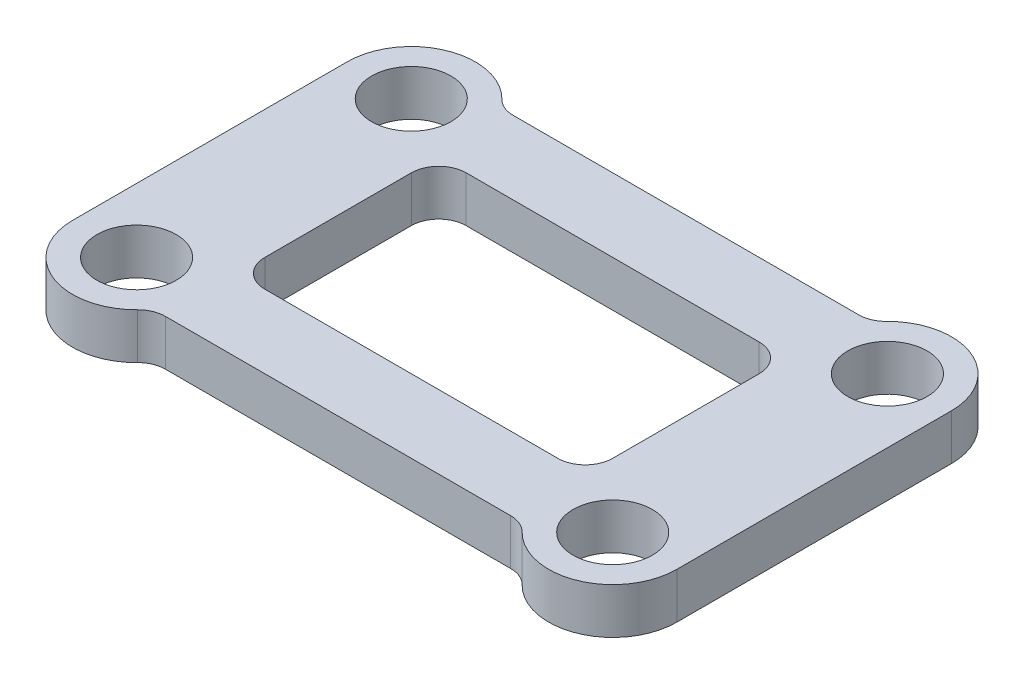
ISO-10303-21;
HEADER;
FILE_DESCRIPTION(('STEP AP214'),'2;1');
FILE_NAME('part.step','',(''),(''),'','','');
FILE_SCHEMA(('AUTOMOTIVE_DESIGN { 1 0 10303 214 1 1 1 1 }'));
ENDSEC;
DATA;
#1=APPLICATION_CONTEXT('core data for automotive mechanical design processes');
#2=APPLICATION_PROTOCOL_DEFINITION('international standard','automotive_design',2000,#1);
#3=PRODUCT_CONTEXT('',#1,'mechanical');
#4=PRODUCT('Part','Part','',(#3));
#5=PRODUCT_RELATED_PRODUCT_CATEGORY('part','',(#4));
#6=PRODUCT_DEFINITION_FORMATION('','',#4);
#7=PRODUCT_DEFINITION_CONTEXT('part definition',#1,'design');
#8=PRODUCT_DEFINITION('design','',#6,#7);
#9=PRODUCT_DEFINITION_SHAPE('','',#8);
#10=(LENGTH_UNIT() NAMED_UNIT(*) SI_UNIT(.MILLI.,.METRE.));
#11=(NAMED_UNIT(*) PLANE_ANGLE_UNIT() SI_UNIT($,.RADIAN.));
#12=(NAMED_UNIT(*) SI_UNIT($,.STERADIAN.) SOLID_ANGLE_UNIT());
#13=UNCERTAINTY_MEASURE_WITH_UNIT(LENGTH_MEASURE(1.E-05),#10,'distance_accuracy_value','');
#14=(GEOMETRIC_REPRESENTATION_CONTEXT(3) GLOBAL_UNCERTAINTY_ASSIGNED_CONTEXT((#13)) GLOBAL_UNIT_ASSIGNED_CONTEXT((#10,
#11,#12)) REPRESENTATION_CONTEXT('',''));
#15=CARTESIAN_POINT('',(0.,0.,0.));
#16=DIRECTION('',(0.,0.,1.));
#17=DIRECTION('',(1.,0.,0.));
#18=AXIS2_PLACEMENT_3D('',#15,#16,#17);
#19=CARTESIAN_POINT('',(-24.765,-22.225,9.525));
#20=DIRECTION('',(-1.,0.,0.));
#21=DIRECTION('',(0.,0.,1.));
#22=AXIS2_PLACEMENT_3D('',#19,#20,#21);
#23=PLANE('',#22);
#24=DIRECTION('',(0.,0.,1.));
#25=VECTOR('',#24,1.);
#26=CARTESIAN_POINT('',(-24.765,-22.225,9.525));
#27=LINE('',#26,#25);
#28=CARTESIAN_POINT('',(-24.765,-22.225,-5.08));
#29=VERTEX_POINT('',#28);
#30=CARTESIAN_POINT('',(-24.765,-22.225,5.08));
#31=VERTEX_POINT('',#30);
#32=EDGE_CURVE('E258',#29,#31,#27,.T.);
#33=ORIENTED_EDGE('',*,*,#32,.F.);
#34=DIRECTION('',(0.,-1.,0.));
#35=VECTOR('',#34,1.);
#36=CARTESIAN_POINT('',(-24.765,-19.05,-5.08));
#37=LINE('',#36,#35);
#38=CARTESIAN_POINT('',(-24.765,-19.05,-5.08));
#39=VERTEX_POINT('',#38);
#40=EDGE_CURVE('E307',#29,#39,#37,.F.);
#41=ORIENTED_EDGE('',*,*,#40,.T.);
#42=DIRECTION('',(0.,0.,1.));
#43=VECTOR('',#42,1.);
#44=CARTESIAN_POINT('',(-24.765,-19.05,9.525));
#45=LINE('',#44,#43);
#46=CARTESIAN_POINT('',(-24.765,-19.05,5.08));
#47=VERTEX_POINT('',#46);
#48=EDGE_CURVE('E251',#39,#47,#45,.T.);
#49=ORIENTED_EDGE('',*,*,#48,.T.);
#50=DIRECTION('',(0.,-1.,0.));
#51=VECTOR('',#50,1.);
#52=CARTESIAN_POINT('',(-24.765,-22.225,5.08));
#53=LINE('',#52,#51);
#54=EDGE_CURVE('E303',#47,#31,#53,.T.);
#55=ORIENTED_EDGE('',*,*,#54,.T.);
#56=EDGE_LOOP('',(#33,#41,#49,#55));
#57=FACE_BOUND('',#56,.T.);
#58=ADVANCED_FACE('F45',(#57),#23,.F.);
#59=CARTESIAN_POINT('',(-0.635,-22.225,9.525));
#60=DIRECTION('',(1.,0.,0.));
#61=DIRECTION('',(0.,0.,-1.));
#62=AXIS2_PLACEMENT_3D('',#59,#60,#61);
#63=PLANE('',#62);
#64=DIRECTION('',(0.,0.,-1.));
#65=VECTOR('',#64,1.);
#66=CARTESIAN_POINT('',(-0.635,-22.225,9.525));
#67=LINE('',#66,#65);
#68=CARTESIAN_POINT('',(-0.635,-22.225,5.08));
#69=VERTEX_POINT('',#68);
#70=CARTESIAN_POINT('',(-0.635,-22.225,-5.08));
#71=VERTEX_POINT('',#70);
#72=EDGE_CURVE('E229',#69,#71,#67,.T.);
#73=ORIENTED_EDGE('',*,*,#72,.F.);
#74=DIRECTION('',(0.,-1.,0.));
#75=VECTOR('',#74,1.);
#76=CARTESIAN_POINT('',(-0.635,-22.225,5.08));
#77=LINE('',#76,#75);
#78=CARTESIAN_POINT('',(-0.635,-19.05,5.08));
#79=VERTEX_POINT('',#78);
#80=EDGE_CURVE('E292',#69,#79,#77,.F.);
#81=ORIENTED_EDGE('',*,*,#80,.T.);
#82=DIRECTION('',(0.,0.,-1.));
#83=VECTOR('',#82,1.);
#84=CARTESIAN_POINT('',(-0.635,-19.05,9.525));
#85=LINE('',#84,#83);
#86=CARTESIAN_POINT('',(-0.635,-19.05,-5.08));
#87=VERTEX_POINT('',#86);
#88=EDGE_CURVE('E213',#79,#87,#85,.T.);
#89=ORIENTED_EDGE('',*,*,#88,.T.);
#90=DIRECTION('',(0.,1.,0.));
#91=VECTOR('',#90,1.);
#92=CARTESIAN_POINT('',(-0.635,-22.225,-5.08));
#93=LINE('',#92,#91);
#94=EDGE_CURVE('E289',#87,#71,#93,.F.);
#95=ORIENTED_EDGE('',*,*,#94,.T.);
#96=EDGE_LOOP('',(#73,#81,#89,#95));
#97=FACE_BOUND('',#96,.T.);
#98=ADVANCED_FACE('F396',(#97),#63,.F.);
#99=CARTESIAN_POINT('',(-29.21,14.3584839524334,12.065));
#100=DIRECTION('',(0.,0.,-1.));
#101=DIRECTION('',(-1.,0.,0.));
#102=AXIS2_PLACEMENT_3D('',#99,#100,#101);
#103=PLANE('',#102);
#104=DIRECTION('',(1.,0.,0.));
#105=VECTOR('',#104,1.);
#106=CARTESIAN_POINT('',(-29.21,-22.225,12.065));
#107=LINE('',#106,#105);
#108=CARTESIAN_POINT('',(-24.6751929478753,-22.225,12.065));
#109=VERTEX_POINT('',#108);
#110=CARTESIAN_POINT('',(-0.724807052124712,-22.225,12.065));
#111=VERTEX_POINT('',#110);
#112=EDGE_CURVE('E218',#109,#111,#107,.T.);
#113=ORIENTED_EDGE('',*,*,#112,.T.);
#114=DIRECTION('',(0.,-1.,0.));
#115=VECTOR('',#114,1.);
#116=CARTESIAN_POINT('',(-0.72480705212471,-19.05,12.065));
#117=LINE('',#116,#115);
#118=CARTESIAN_POINT('',(-0.724807052124712,-19.05,12.065));
#119=VERTEX_POINT('',#118);
#120=EDGE_CURVE('E331',#111,#119,#117,.F.);
#121=ORIENTED_EDGE('',*,*,#120,.T.);
#122=DIRECTION('',(-1.,0.,0.));
#123=VECTOR('',#122,1.);
#124=CARTESIAN_POINT('',(-29.21,-19.05,12.065));
#125=LINE('',#124,#123);
#126=CARTESIAN_POINT('',(-24.6751929478753,-19.05,12.065));
#127=VERTEX_POINT('',#126);
#128=EDGE_CURVE('E235',#119,#127,#125,.T.);
#129=ORIENTED_EDGE('',*,*,#128,.T.);
#130=DIRECTION('',(0.,-1.,0.));
#131=VECTOR('',#130,1.);
#132=CARTESIAN_POINT('',(-24.6751929478753,-22.225,12.065));
#133=LINE('',#132,#131);
#134=EDGE_CURVE('E327',#127,#109,#133,.T.);
#135=ORIENTED_EDGE('',*,*,#134,.T.);
#136=EDGE_LOOP('',(#113,#121,#129,#135));
#137=FACE_BOUND('',#136,.T.);
#138=ADVANCED_FACE('F382',(#137),#103,.F.);
#139=CARTESIAN_POINT('',(-29.21,14.3584839524334,6.985));
#140=DIRECTION('',(0.,0.,-1.));
#141=DIRECTION('',(-1.,0.,0.));
#142=AXIS2_PLACEMENT_3D('',#139,#140,#141);
#143=PLANE('',#142);
#144=DIRECTION('',(-1.,0.,0.));
#145=VECTOR('',#144,1.);
#146=CARTESIAN_POINT('',(-29.21,-19.05,6.985));
#147=LINE('',#146,#145);
#148=CARTESIAN_POINT('',(-2.54,-19.05,6.985));
#149=VERTEX_POINT('',#148);
#150=CARTESIAN_POINT('',(-22.86,-19.05,6.985));
#151=VERTEX_POINT('',#150);
#152=EDGE_CURVE('E239',#149,#151,#147,.T.);
#153=ORIENTED_EDGE('',*,*,#152,.F.);
#154=DIRECTION('',(0.,-1.,0.));
#155=VECTOR('',#154,1.);
#156=CARTESIAN_POINT('',(-2.54,14.3584839524334,6.985));
#157=LINE('',#156,#155);
#158=CARTESIAN_POINT('',(-2.54,-22.225,6.985));
#159=VERTEX_POINT('',#158);
#160=EDGE_CURVE('E285',#149,#159,#157,.T.);
#161=ORIENTED_EDGE('',*,*,#160,.T.);
#162=DIRECTION('',(1.,0.,0.));
#163=VECTOR('',#162,1.);
#164=CARTESIAN_POINT('',(-29.21,-22.225,6.985));
#165=LINE('',#164,#163);
#166=CARTESIAN_POINT('',(-22.86,-22.225,6.985));
#167=VERTEX_POINT('',#166);
#168=EDGE_CURVE('E212',#167,#159,#165,.T.);
#169=ORIENTED_EDGE('',*,*,#168,.F.);
#170=DIRECTION('',(0.,-1.,0.));
#171=VECTOR('',#170,1.);
#172=CARTESIAN_POINT('',(-22.86,14.3584839524334,6.985));
#173=LINE('',#172,#171);
#174=EDGE_CURVE('E282',#167,#151,#173,.F.);
#175=ORIENTED_EDGE('',*,*,#174,.T.);
#176=EDGE_LOOP('',(#153,#161,#169,#175));
#177=FACE_BOUND('',#176,.T.);
#178=ADVANCED_FACE('F420',(#177),#143,.T.);
#179=CARTESIAN_POINT('',(-29.21,-22.225,9.525));
#180=DIRECTION('',(0.,1.,0.));
#181=DIRECTION('',(0.,0.,1.));
#182=AXIS2_PLACEMENT_3D('',#179,#180,#181);
#183=CYLINDRICAL_SURFACE('',#182,4.445);
#184=CARTESIAN_POINT('',(-29.21,-22.225,9.525));
#185=DIRECTION('',(0.,-1.,0.));
#186=DIRECTION('',(0.,0.,-1.));
#187=AXIS2_PLACEMENT_3D('',#184,#185,#186);
#188=CIRCLE('',#187,4.445);
#189=CARTESIAN_POINT('',(-26.0356350635127,-22.225,12.6365));
#190=VERTEX_POINT('',#189);
#191=CARTESIAN_POINT('',(-33.655,-22.225,9.525));
#192=VERTEX_POINT('',#191);
#193=EDGE_CURVE('E247',#190,#192,#188,.T.);
#194=ORIENTED_EDGE('',*,*,#193,.F.);
#195=DIRECTION('',(0.,1.,0.));
#196=VECTOR('',#195,1.);
#197=CARTESIAN_POINT('',(-26.0356350635127,-22.225,12.6365));
#198=LINE('',#197,#196);
#199=CARTESIAN_POINT('',(-26.0356350635127,-19.05,12.6365));
#200=VERTEX_POINT('',#199);
#201=EDGE_CURVE('E67',#190,#200,#198,.T.);
#202=ORIENTED_EDGE('',*,*,#201,.T.);
#203=CARTESIAN_POINT('',(-29.21,-19.05,9.525));
#204=DIRECTION('',(0.,-1.,0.));
#205=DIRECTION('',(0.,0.,-1.));
#206=AXIS2_PLACEMENT_3D('',#203,#204,#205);
#207=CIRCLE('',#206,4.445);
#208=CARTESIAN_POINT('',(-33.655,-19.05,9.525));
#209=VERTEX_POINT('',#208);
#210=EDGE_CURVE('E242',#200,#209,#207,.T.);
#211=ORIENTED_EDGE('',*,*,#210,.T.);
#212=DIRECTION('',(0.,1.,0.));
#213=VECTOR('',#212,1.);
#214=CARTESIAN_POINT('',(-33.655,-22.225,9.525));
#215=LINE('',#214,#213);
#216=EDGE_CURVE('E278',#192,#209,#215,.T.);
#217=ORIENTED_EDGE('',*,*,#216,.F.);
#218=EDGE_LOOP('',(#194,#202,#211,#217));
#219=FACE_BOUND('',#218,.T.);
#220=ADVANCED_FACE('F416',(#219),#183,.T.);
#221=CARTESIAN_POINT('',(-33.655,-22.225,9.525));
#222=DIRECTION('',(1.,0.,0.));
#223=DIRECTION('',(0.,0.,-1.));
#224=AXIS2_PLACEMENT_3D('',#221,#222,#223);
#225=PLANE('',#224);
#226=DIRECTION('',(0.,0.,-1.));
#227=VECTOR('',#226,1.);
#228=CARTESIAN_POINT('',(-33.655,-19.05,9.525));
#229=LINE('',#228,#227);
#230=CARTESIAN_POINT('',(-33.655,-19.05,-9.525));
#231=VERTEX_POINT('',#230);
#232=EDGE_CURVE('E265',#209,#231,#229,.T.);
#233=ORIENTED_EDGE('',*,*,#232,.T.);
#234=DIRECTION('',(0.,1.,0.));
#235=VECTOR('',#234,1.);
#236=CARTESIAN_POINT('',(-33.655,-22.225,-9.525));
#237=LINE('',#236,#235);
#238=CARTESIAN_POINT('',(-33.655,-22.225,-9.525));
#239=VERTEX_POINT('',#238);
#240=EDGE_CURVE('E262',#239,#231,#237,.T.);
#241=ORIENTED_EDGE('',*,*,#240,.F.);
#242=DIRECTION('',(0.,0.,-1.));
#243=VECTOR('',#242,1.);
#244=CARTESIAN_POINT('',(-33.655,-22.225,9.525));
#245=LINE('',#244,#243);
#246=EDGE_CURVE('E250',#192,#239,#245,.T.);
#247=ORIENTED_EDGE('',*,*,#246,.F.);
#248=ORIENTED_EDGE('',*,*,#216,.T.);
#249=EDGE_LOOP('',(#233,#241,#247,#248));
#250=FACE_BOUND('',#249,.T.);
#251=ADVANCED_FACE('F412',(#250),#225,.F.);
#252=CARTESIAN_POINT('',(-29.21,-22.225,-9.525));
#253=DIRECTION('',(0.,1.,0.));
#254=DIRECTION('',(0.,0.,1.));
#255=AXIS2_PLACEMENT_3D('',#252,#253,#254);
#256=CYLINDRICAL_SURFACE('',#255,4.445);
#257=CARTESIAN_POINT('',(-29.21,-19.05,-9.525));
#258=DIRECTION('',(0.,-1.,0.));
#259=DIRECTION('',(0.,0.,-1.));
#260=AXIS2_PLACEMENT_3D('',#257,#258,#259);
#261=CIRCLE('',#260,4.445);
#262=CARTESIAN_POINT('',(-26.0356350635127,-19.05,-12.6365));
#263=VERTEX_POINT('',#262);
#264=EDGE_CURVE('E268',#231,#263,#261,.T.);
#265=ORIENTED_EDGE('',*,*,#264,.T.);
#266=DIRECTION('',(0.,1.,0.));
#267=VECTOR('',#266,1.);
#268=CARTESIAN_POINT('',(-26.0356350635127,-22.225,-12.6365));
#269=LINE('',#268,#267);
#270=CARTESIAN_POINT('',(-26.0356350635127,-22.225,-12.6365));
#271=VERTEX_POINT('',#270);
#272=EDGE_CURVE('E310',#263,#271,#269,.F.);
#273=ORIENTED_EDGE('',*,*,#272,.T.);
#274=CARTESIAN_POINT('',(-29.21,-22.225,-9.525));
#275=DIRECTION('',(0.,-1.,0.));
#276=DIRECTION('',(0.,0.,-1.));
#277=AXIS2_PLACEMENT_3D('',#274,#275,#276);
#278=CIRCLE('',#277,4.445);
#279=EDGE_CURVE('E254',#239,#271,#278,.T.);
#280=ORIENTED_EDGE('',*,*,#279,.F.);
#281=ORIENTED_EDGE('',*,*,#240,.T.);
#282=EDGE_LOOP('',(#265,#273,#280,#281));
#283=FACE_BOUND('',#282,.T.);
#284=ADVANCED_FACE('F409',(#283),#256,.T.);
#285=CARTESIAN_POINT('',(-29.21,-22.225,9.525));
#286=DIRECTION('',(0.,-1.,0.));
#287=DIRECTION('',(0.,0.,-1.));
#288=AXIS2_PLACEMENT_3D('',#285,#286,#287);
#289=PLANE('',#288);
#290=CARTESIAN_POINT('',(-29.21,-22.225,9.525));
#291=DIRECTION('',(0.,-1.,0.));
#292=DIRECTION('',(0.,0.,-1.));
#293=AXIS2_PLACEMENT_3D('',#290,#291,#292);
#294=CIRCLE('',#293,2.74999999999999);
#295=CARTESIAN_POINT('',(-29.21,-22.225,6.77500000000001));
#296=VERTEX_POINT('',#295);
#297=EDGE_CURVE('E519',#296,#296,#294,.T.);
#298=ORIENTED_EDGE('',*,*,#297,.F.);
#299=EDGE_LOOP('',(#298));
#300=FACE_BOUND('',#299,.T.);
#301=CARTESIAN_POINT('',(-29.21,-22.225,-9.525));
#302=DIRECTION('',(0.,-1.,0.));
#303=DIRECTION('',(0.,0.,-1.));
#304=AXIS2_PLACEMENT_3D('',#301,#302,#303);
#305=CIRCLE('',#304,2.74999999999999);
#306=CARTESIAN_POINT('',(-29.21,-22.225,-12.275));
#307=VERTEX_POINT('',#306);
#308=EDGE_CURVE('E511',#307,#307,#305,.T.);
#309=ORIENTED_EDGE('',*,*,#308,.F.);
#310=EDGE_LOOP('',(#309));
#311=FACE_BOUND('',#310,.T.);
#312=CARTESIAN_POINT('',(3.81,-22.225,9.525));
#313=DIRECTION('',(0.,-1.,0.));
#314=DIRECTION('',(0.,0.,-1.));
#315=AXIS2_PLACEMENT_3D('',#312,#313,#314);
#316=CIRCLE('',#315,2.74999999999999);
#317=CARTESIAN_POINT('',(3.81,-22.225,6.77500000000001));
#318=VERTEX_POINT('',#317);
#319=EDGE_CURVE('E503',#318,#318,#316,.T.);
#320=ORIENTED_EDGE('',*,*,#319,.F.);
#321=EDGE_LOOP('',(#320));
#322=FACE_BOUND('',#321,.T.);
#323=CARTESIAN_POINT('',(3.81,-22.225,-9.525));
#324=DIRECTION('',(0.,-1.,0.));
#325=DIRECTION('',(0.,0.,-1.));
#326=AXIS2_PLACEMENT_3D('',#323,#324,#325);
#327=CIRCLE('',#326,2.74999999999999);
#328=CARTESIAN_POINT('',(3.81,-22.225,-12.275));
#329=VERTEX_POINT('',#328);
#330=EDGE_CURVE('E495',#329,#329,#327,.T.);
#331=ORIENTED_EDGE('',*,*,#330,.F.);
#332=EDGE_LOOP('',(#331));
#333=FACE_BOUND('',#332,.T.);
#334=ORIENTED_EDGE('',*,*,#279,.T.);
#335=CARTESIAN_POINT('',(-24.6751929478753,-22.225,-13.97));
#336=DIRECTION('',(0.,-1.,0.));
#337=DIRECTION('',(0.,0.,-1.));
#338=AXIS2_PLACEMENT_3D('',#335,#336,#337);
#339=CIRCLE('',#338,1.905);
#340=CARTESIAN_POINT('',(-24.6751929478753,-22.225,-12.065));
#341=VERTEX_POINT('',#340);
#342=EDGE_CURVE('E348',#271,#341,#339,.F.);
#343=ORIENTED_EDGE('',*,*,#342,.T.);
#344=DIRECTION('',(1.,0.,0.));
#345=VECTOR('',#344,1.);
#346=CARTESIAN_POINT('',(-29.21,-22.225,-12.065));
#347=LINE('',#346,#345);
#348=CARTESIAN_POINT('',(-0.724807052124708,-22.225,-12.065));
#349=VERTEX_POINT('',#348);
#350=EDGE_CURVE('E456',#341,#349,#347,.T.);
#351=ORIENTED_EDGE('',*,*,#350,.T.);
#352=CARTESIAN_POINT('',(-0.724807052124709,-22.225,-13.97));
#353=DIRECTION('',(0.,-1.,0.));
#354=DIRECTION('',(0.,0.,-1.));
#355=AXIS2_PLACEMENT_3D('',#352,#353,#354);
#356=CIRCLE('',#355,1.905);
#357=CARTESIAN_POINT('',(0.635635063512704,-22.225,-12.6365));
#358=VERTEX_POINT('',#357);
#359=EDGE_CURVE('E357',#349,#358,#356,.F.);
#360=ORIENTED_EDGE('',*,*,#359,.T.);
#361=CARTESIAN_POINT('',(3.81,-22.225,-9.525));
#362=DIRECTION('',(0.,-1.,0.));
#363=DIRECTION('',(0.,0.,-1.));
#364=AXIS2_PLACEMENT_3D('',#361,#362,#363);
#365=CIRCLE('',#364,4.445);
#366=CARTESIAN_POINT('',(8.255,-22.225,-9.525));
#367=VERTEX_POINT('',#366);
#368=EDGE_CURVE('E226',#358,#367,#365,.T.);
#369=ORIENTED_EDGE('',*,*,#368,.T.);
#370=DIRECTION('',(0.,0.,1.));
#371=VECTOR('',#370,1.);
#372=CARTESIAN_POINT('',(8.255,-22.225,9.525));
#373=LINE('',#372,#371);
#374=CARTESIAN_POINT('',(8.255,-22.225,9.525));
#375=VERTEX_POINT('',#374);
#376=EDGE_CURVE('E205',#367,#375,#373,.T.);
#377=ORIENTED_EDGE('',*,*,#376,.T.);
#378=CARTESIAN_POINT('',(3.81,-22.225,9.525));
#379=DIRECTION('',(0.,-1.,0.));
#380=DIRECTION('',(0.,0.,-1.));
#381=AXIS2_PLACEMENT_3D('',#378,#379,#380);
#382=CIRCLE('',#381,4.445);
#383=CARTESIAN_POINT('',(0.635635063512703,-22.225,12.6365));
#384=VERTEX_POINT('',#383);
#385=EDGE_CURVE('E195',#375,#384,#382,.T.);
#386=ORIENTED_EDGE('',*,*,#385,.T.);
#387=CARTESIAN_POINT('',(-0.72480705212471,-22.225,13.97));
#388=DIRECTION('',(0.,-1.,0.));
#389=DIRECTION('',(0.,0.,-1.));
#390=AXIS2_PLACEMENT_3D('',#387,#388,#389);
#391=CIRCLE('',#390,1.905);
#392=EDGE_CURVE('E372',#384,#111,#391,.F.);
#393=ORIENTED_EDGE('',*,*,#392,.T.);
#394=ORIENTED_EDGE('',*,*,#112,.F.);
#395=CARTESIAN_POINT('',(-24.6751929478753,-22.225,13.97));
#396=DIRECTION('',(0.,-1.,0.));
#397=DIRECTION('',(0.,0.,-1.));
#398=AXIS2_PLACEMENT_3D('',#395,#396,#397);
#399=CIRCLE('',#398,1.905);
#400=EDGE_CURVE('E54',#109,#190,#399,.F.);
#401=ORIENTED_EDGE('',*,*,#400,.T.);
#402=ORIENTED_EDGE('',*,*,#193,.T.);
#403=ORIENTED_EDGE('',*,*,#246,.T.);
#404=EDGE_LOOP('',(#334,#343,#351,#360,#369,#377,#386,#393,#394,#401,#402,#403));
#405=FACE_BOUND('',#404,.T.);
#406=DIRECTION('',(1.,0.,0.));
#407=VECTOR('',#406,1.);
#408=CARTESIAN_POINT('',(-29.21,-22.225,-6.985));
#409=LINE('',#408,#407);
#410=CARTESIAN_POINT('',(-22.86,-22.225,-6.985));
#411=VERTEX_POINT('',#410);
#412=CARTESIAN_POINT('',(-2.54,-22.225,-6.985));
#413=VERTEX_POINT('',#412);
#414=EDGE_CURVE('E447',#411,#413,#409,.T.);
#415=ORIENTED_EDGE('',*,*,#414,.F.);
#416=CARTESIAN_POINT('',(-22.86,-22.225,-5.08));
#417=DIRECTION('',(0.,-1.,0.));
#418=DIRECTION('',(0.,0.,-1.));
#419=AXIS2_PLACEMENT_3D('',#416,#417,#418);
#420=CIRCLE('',#419,1.905);
#421=EDGE_CURVE('E342',#411,#29,#420,.F.);
#422=ORIENTED_EDGE('',*,*,#421,.T.);
#423=ORIENTED_EDGE('',*,*,#32,.T.);
#424=CARTESIAN_POINT('',(-22.86,-22.225,5.08));
#425=DIRECTION('',(0.,-1.,0.));
#426=DIRECTION('',(0.,0.,-1.));
#427=AXIS2_PLACEMENT_3D('',#424,#425,#426);
#428=CIRCLE('',#427,1.905);
#429=EDGE_CURVE('E366',#31,#167,#428,.F.);
#430=ORIENTED_EDGE('',*,*,#429,.T.);
#431=ORIENTED_EDGE('',*,*,#168,.T.);
#432=CARTESIAN_POINT('',(-2.54,-22.225,5.08));
#433=DIRECTION('',(0.,-1.,0.));
#434=DIRECTION('',(0.,0.,-1.));
#435=AXIS2_PLACEMENT_3D('',#432,#433,#434);
#436=CIRCLE('',#435,1.905);
#437=EDGE_CURVE('E336',#159,#69,#436,.F.);
#438=ORIENTED_EDGE('',*,*,#437,.T.);
#439=ORIENTED_EDGE('',*,*,#72,.T.);
#440=CARTESIAN_POINT('',(-2.54,-22.225,-5.08));
#441=DIRECTION('',(0.,-1.,0.));
#442=DIRECTION('',(0.,0.,-1.));
#443=AXIS2_PLACEMENT_3D('',#440,#441,#442);
#444=CIRCLE('',#443,1.905);
#445=EDGE_CURVE('E363',#71,#413,#444,.F.);
#446=ORIENTED_EDGE('',*,*,#445,.T.);
#447=EDGE_LOOP('',(#415,#422,#423,#430,#431,#438,#439,#446));
#448=FACE_BOUND('',#447,.T.);
#449=ADVANCED_FACE('F377',(#300,#311,#322,#333,#405,#448),#289,.T.);
#450=CARTESIAN_POINT('',(-29.21,-19.05,9.525));
#451=DIRECTION('',(0.,-1.,0.));
#452=DIRECTION('',(0.,0.,-1.));
#453=AXIS2_PLACEMENT_3D('',#450,#451,#452);
#454=PLANE('',#453);
#455=CARTESIAN_POINT('',(-29.21,-19.05,9.525));
#456=DIRECTION('',(0.,-1.,0.));
#457=DIRECTION('',(0.,0.,-1.));
#458=AXIS2_PLACEMENT_3D('',#455,#456,#457);
#459=CIRCLE('',#458,2.75);
#460=CARTESIAN_POINT('',(-29.21,-19.05,6.775));
#461=VERTEX_POINT('',#460);
#462=EDGE_CURVE('E515',#461,#461,#459,.T.);
#463=ORIENTED_EDGE('',*,*,#462,.T.);
#464=EDGE_LOOP('',(#463));
#465=FACE_BOUND('',#464,.T.);
#466=CARTESIAN_POINT('',(-29.21,-19.05,-9.525));
#467=DIRECTION('',(0.,-1.,0.));
#468=DIRECTION('',(0.,0.,-1.));
#469=AXIS2_PLACEMENT_3D('',#466,#467,#468);
#470=CIRCLE('',#469,2.75);
#471=CARTESIAN_POINT('',(-29.21,-19.05,-12.275));
#472=VERTEX_POINT('',#471);
#473=EDGE_CURVE('E507',#472,#472,#470,.T.);
#474=ORIENTED_EDGE('',*,*,#473,.T.);
#475=EDGE_LOOP('',(#474));
#476=FACE_BOUND('',#475,.T.);
#477=CARTESIAN_POINT('',(3.81,-19.05,9.525));
#478=DIRECTION('',(0.,-1.,0.));
#479=DIRECTION('',(0.,0.,-1.));
#480=AXIS2_PLACEMENT_3D('',#477,#478,#479);
#481=CIRCLE('',#480,2.75);
#482=CARTESIAN_POINT('',(3.81,-19.05,6.775));
#483=VERTEX_POINT('',#482);
#484=EDGE_CURVE('E499',#483,#483,#481,.T.);
#485=ORIENTED_EDGE('',*,*,#484,.T.);
#486=EDGE_LOOP('',(#485));
#487=FACE_BOUND('',#486,.T.);
#488=CARTESIAN_POINT('',(3.81,-19.05,-9.525));
#489=DIRECTION('',(0.,-1.,0.));
#490=DIRECTION('',(0.,0.,-1.));
#491=AXIS2_PLACEMENT_3D('',#488,#489,#490);
#492=CIRCLE('',#491,2.75);
#493=CARTESIAN_POINT('',(3.81,-19.05,-12.275));
#494=VERTEX_POINT('',#493);
#495=EDGE_CURVE('E463',#494,#494,#492,.T.);
#496=ORIENTED_EDGE('',*,*,#495,.T.);
#497=EDGE_LOOP('',(#496));
#498=FACE_BOUND('',#497,.T.);
#499=ORIENTED_EDGE('',*,*,#48,.F.);
#500=CARTESIAN_POINT('',(-22.86,-19.05,-5.08));
#501=DIRECTION('',(0.,-1.,0.));
#502=DIRECTION('',(0.,0.,-1.));
#503=AXIS2_PLACEMENT_3D('',#500,#501,#502);
#504=CIRCLE('',#503,1.905);
#505=CARTESIAN_POINT('',(-22.86,-19.05,-6.985));
#506=VERTEX_POINT('',#505);
#507=EDGE_CURVE('E345',#39,#506,#504,.T.);
#508=ORIENTED_EDGE('',*,*,#507,.T.);
#509=DIRECTION('',(-1.,0.,0.));
#510=VECTOR('',#509,1.);
#511=CARTESIAN_POINT('',(-29.21,-19.05,-6.985));
#512=LINE('',#511,#510);
#513=CARTESIAN_POINT('',(-2.54,-19.05,-6.985));
#514=VERTEX_POINT('',#513);
#515=EDGE_CURVE('E455',#514,#506,#512,.T.);
#516=ORIENTED_EDGE('',*,*,#515,.F.);
#517=CARTESIAN_POINT('',(-2.54,-19.05,-5.08));
#518=DIRECTION('',(0.,-1.,0.));
#519=DIRECTION('',(0.,0.,-1.));
#520=AXIS2_PLACEMENT_3D('',#517,#518,#519);
#521=CIRCLE('',#520,1.905);
#522=EDGE_CURVE('E360',#514,#87,#521,.T.);
#523=ORIENTED_EDGE('',*,*,#522,.T.);
#524=ORIENTED_EDGE('',*,*,#88,.F.);
#525=CARTESIAN_POINT('',(-2.54,-19.05,5.08));
#526=DIRECTION('',(0.,-1.,0.));
#527=DIRECTION('',(0.,0.,-1.));
#528=AXIS2_PLACEMENT_3D('',#525,#526,#527);
#529=CIRCLE('',#528,1.905);
#530=EDGE_CURVE('E339',#79,#149,#529,.T.);
#531=ORIENTED_EDGE('',*,*,#530,.T.);
#532=ORIENTED_EDGE('',*,*,#152,.T.);
#533=CARTESIAN_POINT('',(-22.86,-19.05,5.08));
#534=DIRECTION('',(0.,-1.,0.));
#535=DIRECTION('',(0.,0.,-1.));
#536=AXIS2_PLACEMENT_3D('',#533,#534,#535);
#537=CIRCLE('',#536,1.905);
#538=EDGE_CURVE('E369',#151,#47,#537,.T.);
#539=ORIENTED_EDGE('',*,*,#538,.T.);
#540=EDGE_LOOP('',(#499,#508,#516,#523,#524,#531,#532,#539));
#541=FACE_BOUND('',#540,.T.);
#542=CARTESIAN_POINT('',(3.81,-19.05,-9.525));
#543=DIRECTION('',(0.,-1.,0.));
#544=DIRECTION('',(0.,0.,-1.));
#545=AXIS2_PLACEMENT_3D('',#542,#543,#544);
#546=CIRCLE('',#545,4.445);
#547=CARTESIAN_POINT('',(0.635635063512704,-19.05,-12.6365));
#548=VERTEX_POINT('',#547);
#549=CARTESIAN_POINT('',(8.255,-19.05,-9.525));
#550=VERTEX_POINT('',#549);
#551=EDGE_CURVE('E194',#548,#550,#546,.T.);
#552=ORIENTED_EDGE('',*,*,#551,.F.);
#553=CARTESIAN_POINT('',(-0.724807052124709,-19.05,-13.97));
#554=DIRECTION('',(0.,-1.,0.));
#555=DIRECTION('',(0.,0.,-1.));
#556=AXIS2_PLACEMENT_3D('',#553,#554,#555);
#557=CIRCLE('',#556,1.905);
#558=CARTESIAN_POINT('',(-0.724807052124708,-19.05,-12.065));
#559=VERTEX_POINT('',#558);
#560=EDGE_CURVE('E354',#548,#559,#557,.T.);
#561=ORIENTED_EDGE('',*,*,#560,.T.);
#562=DIRECTION('',(-1.,0.,0.));
#563=VECTOR('',#562,1.);
#564=CARTESIAN_POINT('',(-29.21,-19.05,-12.065));
#565=LINE('',#564,#563);
#566=CARTESIAN_POINT('',(-24.6751929478753,-19.05,-12.065));
#567=VERTEX_POINT('',#566);
#568=EDGE_CURVE('E460',#559,#567,#565,.T.);
#569=ORIENTED_EDGE('',*,*,#568,.T.);
#570=CARTESIAN_POINT('',(-24.6751929478753,-19.05,-13.97));
#571=DIRECTION('',(0.,-1.,0.));
#572=DIRECTION('',(0.,0.,-1.));
#573=AXIS2_PLACEMENT_3D('',#570,#571,#572);
#574=CIRCLE('',#573,1.905);
#575=EDGE_CURVE('E351',#567,#263,#574,.T.);
#576=ORIENTED_EDGE('',*,*,#575,.T.);
#577=ORIENTED_EDGE('',*,*,#264,.F.);
#578=ORIENTED_EDGE('',*,*,#232,.F.);
#579=ORIENTED_EDGE('',*,*,#210,.F.);
#580=CARTESIAN_POINT('',(-24.6751929478753,-19.05,13.97));
#581=DIRECTION('',(0.,-1.,0.));
#582=DIRECTION('',(0.,0.,-1.));
#583=AXIS2_PLACEMENT_3D('',#580,#581,#582);
#584=CIRCLE('',#583,1.905);
#585=EDGE_CURVE('E11',#200,#127,#584,.T.);
#586=ORIENTED_EDGE('',*,*,#585,.T.);
#587=ORIENTED_EDGE('',*,*,#128,.F.);
#588=CARTESIAN_POINT('',(-0.72480705212471,-19.05,13.97));
#589=DIRECTION('',(0.,-1.,0.));
#590=DIRECTION('',(0.,0.,-1.));
#591=AXIS2_PLACEMENT_3D('',#588,#589,#590);
#592=CIRCLE('',#591,1.905);
#593=CARTESIAN_POINT('',(0.635635063512703,-19.05,12.6365));
#594=VERTEX_POINT('',#593);
#595=EDGE_CURVE('E210',#119,#594,#592,.T.);
#596=ORIENTED_EDGE('',*,*,#595,.T.);
#597=CARTESIAN_POINT('',(3.81,-19.05,9.525));
#598=DIRECTION('',(0.,-1.,0.));
#599=DIRECTION('',(0.,0.,-1.));
#600=AXIS2_PLACEMENT_3D('',#597,#598,#599);
#601=CIRCLE('',#600,4.445);
#602=CARTESIAN_POINT('',(8.255,-19.05,9.525));
#603=VERTEX_POINT('',#602);
#604=EDGE_CURVE('E201',#603,#594,#601,.T.);
#605=ORIENTED_EDGE('',*,*,#604,.F.);
#606=DIRECTION('',(0.,0.,1.));
#607=VECTOR('',#606,1.);
#608=CARTESIAN_POINT('',(8.255,-19.05,9.525));
#609=LINE('',#608,#607);
#610=EDGE_CURVE('E182',#550,#603,#609,.T.);
#611=ORIENTED_EDGE('',*,*,#610,.F.);
#612=EDGE_LOOP('',(#552,#561,#569,#576,#577,#578,#579,#586,#587,#596,#605,#611));
#613=FACE_BOUND('',#612,.T.);
#614=ADVANCED_FACE('F207',(#465,#476,#487,#498,#541,#613),#454,.F.);
#615=CARTESIAN_POINT('',(3.81,-22.225,9.525));
#616=DIRECTION('',(0.,1.,0.));
#617=DIRECTION('',(0.,0.,1.));
#618=AXIS2_PLACEMENT_3D('',#615,#616,#617);
#619=CYLINDRICAL_SURFACE('',#618,4.445);
#620=ORIENTED_EDGE('',*,*,#604,.T.);
#621=DIRECTION('',(0.,1.,0.));
#622=VECTOR('',#621,1.);
#623=CARTESIAN_POINT('',(0.635635063512703,-22.225,12.6365));
#624=LINE('',#623,#622);
#625=EDGE_CURVE('E324',#594,#384,#624,.F.);
#626=ORIENTED_EDGE('',*,*,#625,.T.);
#627=ORIENTED_EDGE('',*,*,#385,.F.);
#628=DIRECTION('',(0.,1.,0.));
#629=VECTOR('',#628,1.);
#630=CARTESIAN_POINT('',(8.255,-22.225,9.525));
#631=LINE('',#630,#629);
#632=EDGE_CURVE('E186',#375,#603,#631,.T.);
#633=ORIENTED_EDGE('',*,*,#632,.T.);
#634=EDGE_LOOP('',(#620,#626,#627,#633));
#635=FACE_BOUND('',#634,.T.);
#636=ADVANCED_FACE('F199',(#635),#619,.T.);
#637=CARTESIAN_POINT('',(3.81,-22.225,-9.525));
#638=DIRECTION('',(0.,1.,0.));
#639=DIRECTION('',(0.,0.,1.));
#640=AXIS2_PLACEMENT_3D('',#637,#638,#639);
#641=CYLINDRICAL_SURFACE('',#640,4.445);
#642=ORIENTED_EDGE('',*,*,#368,.F.);
#643=DIRECTION('',(0.,1.,0.));
#644=VECTOR('',#643,1.);
#645=CARTESIAN_POINT('',(0.635635063512704,-22.225,-12.6365));
#646=LINE('',#645,#644);
#647=EDGE_CURVE('E320',#358,#548,#646,.T.);
#648=ORIENTED_EDGE('',*,*,#647,.T.);
#649=ORIENTED_EDGE('',*,*,#551,.T.);
#650=DIRECTION('',(0.,1.,0.));
#651=VECTOR('',#650,1.);
#652=CARTESIAN_POINT('',(8.255,-22.225,-9.525));
#653=LINE('',#652,#651);
#654=EDGE_CURVE('E189',#367,#550,#653,.T.);
#655=ORIENTED_EDGE('',*,*,#654,.F.);
#656=EDGE_LOOP('',(#642,#648,#649,#655));
#657=FACE_BOUND('',#656,.T.);
#658=ADVANCED_FACE('F471',(#657),#641,.T.);
#659=CARTESIAN_POINT('',(8.255,-22.225,9.525));
#660=DIRECTION('',(-1.,0.,0.));
#661=DIRECTION('',(0.,0.,1.));
#662=AXIS2_PLACEMENT_3D('',#659,#660,#661);
#663=PLANE('',#662);
#664=ORIENTED_EDGE('',*,*,#610,.T.);
#665=ORIENTED_EDGE('',*,*,#632,.F.);
#666=ORIENTED_EDGE('',*,*,#376,.F.);
#667=ORIENTED_EDGE('',*,*,#654,.T.);
#668=EDGE_LOOP('',(#664,#665,#666,#667));
#669=FACE_BOUND('',#668,.T.);
#670=ADVANCED_FACE('F184',(#669),#663,.F.);
#671=CARTESIAN_POINT('',(-29.21,14.3584839524334,-6.985));
#672=DIRECTION('',(0.,0.,-1.));
#673=DIRECTION('',(-1.,0.,0.));
#674=AXIS2_PLACEMENT_3D('',#671,#672,#673);
#675=PLANE('',#674);
#676=ORIENTED_EDGE('',*,*,#515,.T.);
#677=DIRECTION('',(0.,-1.,0.));
#678=VECTOR('',#677,1.);
#679=CARTESIAN_POINT('',(-22.86,-22.225,-6.985));
#680=LINE('',#679,#678);
#681=EDGE_CURVE('E299',#506,#411,#680,.T.);
#682=ORIENTED_EDGE('',*,*,#681,.T.);
#683=ORIENTED_EDGE('',*,*,#414,.T.);
#684=DIRECTION('',(0.,1.,0.));
#685=VECTOR('',#684,1.);
#686=CARTESIAN_POINT('',(-2.54,-19.05,-6.985));
#687=LINE('',#686,#685);
#688=EDGE_CURVE('E295',#413,#514,#687,.T.);
#689=ORIENTED_EDGE('',*,*,#688,.T.);
#690=EDGE_LOOP('',(#676,#682,#683,#689));
#691=FACE_BOUND('',#690,.T.);
#692=ADVANCED_FACE('F451',(#691),#675,.F.);
#693=CARTESIAN_POINT('',(-29.21,14.3584839524334,-12.065));
#694=DIRECTION('',(0.,0.,-1.));
#695=DIRECTION('',(-1.,0.,0.));
#696=AXIS2_PLACEMENT_3D('',#693,#694,#695);
#697=PLANE('',#696);
#698=ORIENTED_EDGE('',*,*,#350,.F.);
#699=DIRECTION('',(0.,1.,0.));
#700=VECTOR('',#699,1.);
#701=CARTESIAN_POINT('',(-24.6751929478753,14.3584839524334,-12.065));
#702=LINE('',#701,#700);
#703=EDGE_CURVE('E317',#341,#567,#702,.T.);
#704=ORIENTED_EDGE('',*,*,#703,.T.);
#705=ORIENTED_EDGE('',*,*,#568,.F.);
#706=DIRECTION('',(0.,1.,0.));
#707=VECTOR('',#706,1.);
#708=CARTESIAN_POINT('',(-0.724807052124708,14.3584839524334,-12.065));
#709=LINE('',#708,#707);
#710=EDGE_CURVE('E314',#559,#349,#709,.F.);
#711=ORIENTED_EDGE('',*,*,#710,.T.);
#712=EDGE_LOOP('',(#698,#704,#705,#711));
#713=FACE_BOUND('',#712,.T.);
#714=ADVANCED_FACE('F479',(#713),#697,.T.);
#715=CARTESIAN_POINT('',(3.81,-22.225,-9.525));
#716=DIRECTION('',(0.,-1.,0.));
#717=DIRECTION('',(0.,0.,-1.));
#718=AXIS2_PLACEMENT_3D('',#715,#716,#717);
#719=CYLINDRICAL_SURFACE('',#718,2.74999999999999);
#720=ORIENTED_EDGE('',*,*,#495,.F.);
#721=EDGE_LOOP('',(#720));
#722=FACE_BOUND('',#721,.T.);
#723=ORIENTED_EDGE('',*,*,#330,.T.);
#724=EDGE_LOOP('',(#723));
#725=FACE_BOUND('',#724,.T.);
#726=ADVANCED_FACE('F533',(#722,#725),#719,.F.);
#727=CARTESIAN_POINT('',(3.81,-22.225,9.525));
#728=DIRECTION('',(0.,-1.,0.));
#729=DIRECTION('',(0.,0.,-1.));
#730=AXIS2_PLACEMENT_3D('',#727,#728,#729);
#731=CYLINDRICAL_SURFACE('',#730,2.74999999999999);
#732=ORIENTED_EDGE('',*,*,#484,.F.);
#733=EDGE_LOOP('',(#732));
#734=FACE_BOUND('',#733,.T.);
#735=ORIENTED_EDGE('',*,*,#319,.T.);
#736=EDGE_LOOP('',(#735));
#737=FACE_BOUND('',#736,.T.);
#738=ADVANCED_FACE('F535',(#734,#737),#731,.F.);
#739=CARTESIAN_POINT('',(-29.21,-22.225,-9.525));
#740=DIRECTION('',(0.,-1.,0.));
#741=DIRECTION('',(0.,0.,-1.));
#742=AXIS2_PLACEMENT_3D('',#739,#740,#741);
#743=CYLINDRICAL_SURFACE('',#742,2.74999999999999);
#744=ORIENTED_EDGE('',*,*,#473,.F.);
#745=EDGE_LOOP('',(#744));
#746=FACE_BOUND('',#745,.T.);
#747=ORIENTED_EDGE('',*,*,#308,.T.);
#748=EDGE_LOOP('',(#747));
#749=FACE_BOUND('',#748,.T.);
#750=ADVANCED_FACE('F542',(#746,#749),#743,.F.);
#751=CARTESIAN_POINT('',(-29.21,-22.225,9.525));
#752=DIRECTION('',(0.,-1.,0.));
#753=DIRECTION('',(0.,0.,-1.));
#754=AXIS2_PLACEMENT_3D('',#751,#752,#753);
#755=CYLINDRICAL_SURFACE('',#754,2.74999999999999);
#756=ORIENTED_EDGE('',*,*,#462,.F.);
#757=EDGE_LOOP('',(#756));
#758=FACE_BOUND('',#757,.T.);
#759=ORIENTED_EDGE('',*,*,#297,.T.);
#760=EDGE_LOOP('',(#759));
#761=FACE_BOUND('',#760,.T.);
#762=ADVANCED_FACE('F425',(#758,#761),#755,.F.);
#763=CARTESIAN_POINT('',(-2.54,14.3584839524334,5.08));
#764=DIRECTION('',(0.,-1.,0.));
#765=DIRECTION('',(0.,0.,-1.));
#766=AXIS2_PLACEMENT_3D('',#763,#764,#765);
#767=CYLINDRICAL_SURFACE('',#766,1.905);
#768=ORIENTED_EDGE('',*,*,#530,.F.);
#769=ORIENTED_EDGE('',*,*,#80,.F.);
#770=ORIENTED_EDGE('',*,*,#437,.F.);
#771=ORIENTED_EDGE('',*,*,#160,.F.);
#772=EDGE_LOOP('',(#768,#769,#770,#771));
#773=FACE_BOUND('',#772,.T.);
#774=ADVANCED_FACE('F421',(#773),#767,.F.);
#775=CARTESIAN_POINT('',(-22.86,14.3584839524334,-5.08));
#776=DIRECTION('',(0.,1.,0.));
#777=DIRECTION('',(0.,0.,1.));
#778=AXIS2_PLACEMENT_3D('',#775,#776,#777);
#779=CYLINDRICAL_SURFACE('',#778,1.905);
#780=ORIENTED_EDGE('',*,*,#507,.F.);
#781=ORIENTED_EDGE('',*,*,#40,.F.);
#782=ORIENTED_EDGE('',*,*,#421,.F.);
#783=ORIENTED_EDGE('',*,*,#681,.F.);
#784=EDGE_LOOP('',(#780,#781,#782,#783));
#785=FACE_BOUND('',#784,.T.);
#786=ADVANCED_FACE('F424',(#785),#779,.F.);
#787=CARTESIAN_POINT('',(-24.6751929478753,-22.225,-13.97));
#788=DIRECTION('',(0.,1.,0.));
#789=DIRECTION('',(0.,0.,1.));
#790=AXIS2_PLACEMENT_3D('',#787,#788,#789);
#791=CYLINDRICAL_SURFACE('',#790,1.905);
#792=ORIENTED_EDGE('',*,*,#575,.F.);
#793=ORIENTED_EDGE('',*,*,#703,.F.);
#794=ORIENTED_EDGE('',*,*,#342,.F.);
#795=ORIENTED_EDGE('',*,*,#272,.F.);
#796=EDGE_LOOP('',(#792,#793,#794,#795));
#797=FACE_BOUND('',#796,.T.);
#798=ADVANCED_FACE('F429',(#797),#791,.F.);
#799=CARTESIAN_POINT('',(-0.724807052124709,-22.225,-13.97));
#800=DIRECTION('',(0.,1.,0.));
#801=DIRECTION('',(0.,0.,1.));
#802=AXIS2_PLACEMENT_3D('',#799,#800,#801);
#803=CYLINDRICAL_SURFACE('',#802,1.905);
#804=ORIENTED_EDGE('',*,*,#359,.F.);
#805=ORIENTED_EDGE('',*,*,#710,.F.);
#806=ORIENTED_EDGE('',*,*,#560,.F.);
#807=ORIENTED_EDGE('',*,*,#647,.F.);
#808=EDGE_LOOP('',(#804,#805,#806,#807));
#809=FACE_BOUND('',#808,.T.);
#810=ADVANCED_FACE('F433',(#809),#803,.F.);
#811=CARTESIAN_POINT('',(-2.54,14.3584839524334,-5.08));
#812=DIRECTION('',(0.,-1.,0.));
#813=DIRECTION('',(0.,0.,-1.));
#814=AXIS2_PLACEMENT_3D('',#811,#812,#813);
#815=CYLINDRICAL_SURFACE('',#814,1.905);
#816=ORIENTED_EDGE('',*,*,#445,.F.);
#817=ORIENTED_EDGE('',*,*,#94,.F.);
#818=ORIENTED_EDGE('',*,*,#522,.F.);
#819=ORIENTED_EDGE('',*,*,#688,.F.);
#820=EDGE_LOOP('',(#816,#817,#818,#819));
#821=FACE_BOUND('',#820,.T.);
#822=ADVANCED_FACE('F392',(#821),#815,.F.);
#823=CARTESIAN_POINT('',(-22.86,-22.225,5.08));
#824=DIRECTION('',(0.,-1.,0.));
#825=DIRECTION('',(0.,0.,-1.));
#826=AXIS2_PLACEMENT_3D('',#823,#824,#825);
#827=CYLINDRICAL_SURFACE('',#826,1.905);
#828=ORIENTED_EDGE('',*,*,#538,.F.);
#829=ORIENTED_EDGE('',*,*,#174,.F.);
#830=ORIENTED_EDGE('',*,*,#429,.F.);
#831=ORIENTED_EDGE('',*,*,#54,.F.);
#832=EDGE_LOOP('',(#828,#829,#830,#831));
#833=FACE_BOUND('',#832,.T.);
#834=ADVANCED_FACE('F386',(#833),#827,.F.);
#835=CARTESIAN_POINT('',(-0.72480705212471,-22.225,13.97));
#836=DIRECTION('',(0.,1.,0.));
#837=DIRECTION('',(0.,0.,1.));
#838=AXIS2_PLACEMENT_3D('',#835,#836,#837);
#839=CYLINDRICAL_SURFACE('',#838,1.905);
#840=ORIENTED_EDGE('',*,*,#595,.F.);
#841=ORIENTED_EDGE('',*,*,#120,.F.);
#842=ORIENTED_EDGE('',*,*,#392,.F.);
#843=ORIENTED_EDGE('',*,*,#625,.F.);
#844=EDGE_LOOP('',(#840,#841,#842,#843));
#845=FACE_BOUND('',#844,.T.);
#846=ADVANCED_FACE('F384',(#845),#839,.F.);
#847=CARTESIAN_POINT('',(-24.6751929478753,-22.225,13.97));
#848=DIRECTION('',(0.,1.,0.));
#849=DIRECTION('',(0.,0.,1.));
#850=AXIS2_PLACEMENT_3D('',#847,#848,#849);
#851=CYLINDRICAL_SURFACE('',#850,1.905);
#852=ORIENTED_EDGE('',*,*,#585,.F.);
#853=ORIENTED_EDGE('',*,*,#201,.F.);
#854=ORIENTED_EDGE('',*,*,#400,.F.);
#855=ORIENTED_EDGE('',*,*,#134,.F.);
#856=EDGE_LOOP('',(#852,#853,#854,#855));
#857=FACE_BOUND('',#856,.T.);
#858=ADVANCED_FACE('F47',(#857),#851,.F.);
#859=CLOSED_SHELL('',(#58,#98,#138,#178,#220,#251,#284,#449,#614,#636,#658,#670,#692,#714,#726,
#738,#750,#762,#774,#786,#798,#810,#822,#834,#846,#858));
#860=MANIFOLD_SOLID_BREP('B2',#859);
#861=ADVANCED_BREP_SHAPE_REPRESENTATION('',(#18,#860),#14);
#862=SHAPE_DEFINITION_REPRESENTATION(#9,#861);
ENDSEC;
END-ISO-10303-21;
